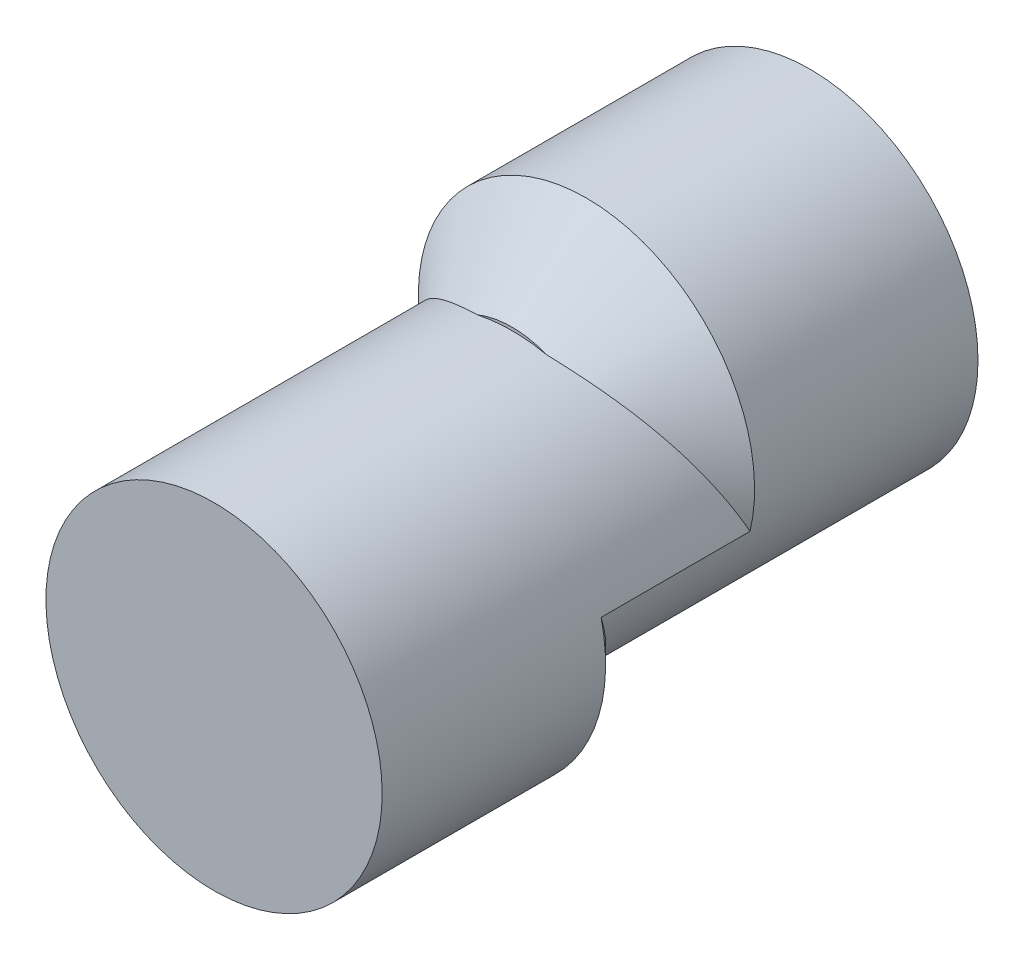
ISO-10303-21;
HEADER;
FILE_DESCRIPTION(('STEP AP214'),'2;1');
FILE_NAME('part.step','',(''),(''),'','','');
FILE_SCHEMA(('AUTOMOTIVE_DESIGN { 1 0 10303 214 1 1 1 1 }'));
ENDSEC;
DATA;
#1=APPLICATION_CONTEXT('core data for automotive mechanical design processes');
#2=APPLICATION_PROTOCOL_DEFINITION('international standard','automotive_design',2000,#1);
#3=PRODUCT_CONTEXT('',#1,'mechanical');
#4=PRODUCT('Part','Part','',(#3));
#5=PRODUCT_RELATED_PRODUCT_CATEGORY('part','',(#4));
#6=PRODUCT_DEFINITION_FORMATION('','',#4);
#7=PRODUCT_DEFINITION_CONTEXT('part definition',#1,'design');
#8=PRODUCT_DEFINITION('design','',#6,#7);
#9=PRODUCT_DEFINITION_SHAPE('','',#8);
#10=(LENGTH_UNIT() NAMED_UNIT(*) SI_UNIT(.MILLI.,.METRE.));
#11=(NAMED_UNIT(*) PLANE_ANGLE_UNIT() SI_UNIT($,.RADIAN.));
#12=(NAMED_UNIT(*) SI_UNIT($,.STERADIAN.) SOLID_ANGLE_UNIT());
#13=UNCERTAINTY_MEASURE_WITH_UNIT(LENGTH_MEASURE(1.E-05),#10,'distance_accuracy_value','');
#14=(GEOMETRIC_REPRESENTATION_CONTEXT(3) GLOBAL_UNCERTAINTY_ASSIGNED_CONTEXT((#13)) GLOBAL_UNIT_ASSIGNED_CONTEXT((#10,
#11,#12)) REPRESENTATION_CONTEXT('',''));
#15=CARTESIAN_POINT('',(0.,0.,0.));
#16=DIRECTION('',(0.,0.,1.));
#17=DIRECTION('',(1.,0.,0.));
#18=AXIS2_PLACEMENT_3D('',#15,#16,#17);
#19=CARTESIAN_POINT('',(0.,0.822072072072072,7.));
#20=DIRECTION('',(0.,0.,-1.));
#21=DIRECTION('',(-1.,0.,0.));
#22=AXIS2_PLACEMENT_3D('',#19,#20,#21);
#23=CYLINDRICAL_SURFACE('',#22,3.95);
#24=CARTESIAN_POINT('',(0.,0.822072072072072,7.));
#25=DIRECTION('',(0.,0.,1.));
#26=DIRECTION('',(1.,0.,0.));
#27=AXIS2_PLACEMENT_3D('',#24,#25,#26);
#28=CIRCLE('',#27,3.95);
#29=CARTESIAN_POINT('',(-0.817850044232283,-3.04233231995903,7.));
#30=VERTEX_POINT('',#29);
#31=CARTESIAN_POINT('',(0.817850044232283,-3.04233231995903,7.));
#32=VERTEX_POINT('',#31);
#33=EDGE_CURVE('E126',#30,#32,#28,.T.);
#34=ORIENTED_EDGE('',*,*,#33,.F.);
#35=CARTESIAN_POINT('',(-0.817850044232284,-3.04233231995903,7.));
#36=CARTESIAN_POINT('',(-0.912082582638536,-3.0223924852395,7.01651049900244));
#37=CARTESIAN_POINT('',(-1.00507197133809,-2.99910784635031,7.03561319296323));
#38=CARTESIAN_POINT('',(-1.18807390143181,-2.94622171986774,7.07831128281761));
#39=CARTESIAN_POINT('',(-1.27808949485708,-2.91662695671472,7.10190189326148));
#40=CARTESIAN_POINT('',(-1.54223198031981,-2.8192316380572,7.17814181924992));
#41=CARTESIAN_POINT('',(-1.71153413884567,-2.74258516675664,7.23646234309769));
#42=CARTESIAN_POINT('',(-2.04227882898572,-2.56445527612452,7.3662926797048));
#43=CARTESIAN_POINT('',(-2.2029818184253,-2.46197669206169,7.43829230832619));
#44=CARTESIAN_POINT('',(-2.50627736822124,-2.23681839039009,7.58947122317375));
#45=CARTESIAN_POINT('',(-2.6488307041962,-2.11409619335581,7.66866544618592));
#46=CARTESIAN_POINT('',(-2.94146233487049,-1.82388392597771,7.84791554108272));
#47=CARTESIAN_POINT('',(-3.08700773469803,-1.65238336517062,7.94890047611089));
#48=CARTESIAN_POINT('',(-3.34648402817079,-1.28824988998564,8.15299210206665));
#49=CARTESIAN_POINT('',(-3.46043500514819,-1.09563050918966,8.25609740017638));
#50=CARTESIAN_POINT('',(-3.6193832482977,-0.766305760925952,8.42470870122634));
#51=CARTESIAN_POINT('',(-3.67443451002463,-0.634442995210983,8.49038438528838));
#52=CARTESIAN_POINT('',(-3.76997644920464,-0.365414659297381,8.62090972014171));
#53=CARTESIAN_POINT('',(-3.81048820823831,-0.22825708876252,8.68576043432434));
#54=CARTESIAN_POINT('',(-3.84350274372788,-0.0889639639639634,8.75));
#55=B_SPLINE_CURVE_WITH_KNOTS('',3,(#35,#36,#37,#38,#39,#40,#41,#42,#43,#44,#45,#46,#47,#48,#49,
#50,#51,#52,#53,#54),.UNSPECIFIED.,.F.,.F.,(4,2,2,2,2,2,2,2,2,4),(0.,0.292942004280142,
0.585573378765179,1.16750707255859,1.7766973323255,2.38718257666698,3.1238281391609,
3.86000436586059,4.33108446072667,4.80147872594641),.UNSPECIFIED.);
#56=CARTESIAN_POINT('',(-3.84350274372788,-0.0889639639639638,8.75));
#57=VERTEX_POINT('',#56);
#58=EDGE_CURVE('E11',#30,#57,#55,.T.);
#59=ORIENTED_EDGE('',*,*,#58,.T.);
#60=DIRECTION('',(0.,0.,-1.));
#61=VECTOR('',#60,1.);
#62=CARTESIAN_POINT('',(-3.84350274372788,-0.0889639639639638,7.));
#63=LINE('',#62,#61);
#64=CARTESIAN_POINT('',(-3.84350274372788,-0.0889639639639638,5.24999999999999));
#65=VERTEX_POINT('',#64);
#66=EDGE_CURVE('E138',#57,#65,#63,.T.);
#67=ORIENTED_EDGE('',*,*,#66,.T.);
#68=CARTESIAN_POINT('',(0.,0.822072072072072,5.24999999999999));
#69=DIRECTION('',(0.,0.,1.));
#70=DIRECTION('',(1.,0.,0.));
#71=AXIS2_PLACEMENT_3D('',#68,#69,#70);
#72=CIRCLE('',#71,3.95);
#73=CARTESIAN_POINT('',(3.84350274372788,-0.0889639639639638,5.24999999999999));
#74=VERTEX_POINT('',#73);
#75=EDGE_CURVE('E135',#65,#74,#72,.F.);
#76=ORIENTED_EDGE('',*,*,#75,.T.);
#77=DIRECTION('',(0.,0.,-1.));
#78=VECTOR('',#77,1.);
#79=CARTESIAN_POINT('',(3.84350274372788,-0.0889639639639638,5.24999999999999));
#80=LINE('',#79,#78);
#81=CARTESIAN_POINT('',(3.84350274372788,-0.0889639639639638,8.75));
#82=VERTEX_POINT('',#81);
#83=EDGE_CURVE('E133',#74,#82,#80,.F.);
#84=ORIENTED_EDGE('',*,*,#83,.T.);
#85=CARTESIAN_POINT('',(3.84350274372788,-0.0889639639639638,8.75));
#86=CARTESIAN_POINT('',(3.81528769779431,-0.20797122697141,8.69510735005948));
#87=CARTESIAN_POINT('',(3.78161742052337,-0.325406206503519,8.63978680771635));
#88=CARTESIAN_POINT('',(3.70367041907941,-0.556408073284509,8.52855999596291));
#89=CARTESIAN_POINT('',(3.65939423951785,-0.669975158807256,8.47265375676896));
#90=CARTESIAN_POINT('',(3.5110404817319,-1.00395867488094,8.30437684903749));
#91=CARTESIAN_POINT('',(3.39147681532019,-1.21749378591338,8.19152326659151));
#92=CARTESIAN_POINT('',(3.11442796893997,-1.61979077842719,7.96803786349388));
#93=CARTESIAN_POINT('',(2.95690765466462,-1.8085294556744,7.85740820479857));
#94=CARTESIAN_POINT('',(2.60700994836441,-2.15560786504676,7.64301673621841));
#95=CARTESIAN_POINT('',(2.41464321116462,-2.31395685888512,7.53925284022612));
#96=CARTESIAN_POINT('',(2.12460170019812,-2.50936020798202,7.40455946929118));
#97=CARTESIAN_POINT('',(2.03988481876867,-2.56192181069743,7.36748258003037));
#98=CARTESIAN_POINT('',(1.86575297698397,-2.66095620959624,7.29620671982021));
#99=CARTESIAN_POINT('',(1.77633771639555,-2.70742861600672,7.26200793314992));
#100=CARTESIAN_POINT('',(1.59343136564689,-2.79368135750707,7.19732480125986));
#101=CARTESIAN_POINT('',(1.49995421738171,-2.83348260882192,7.16682893233663));
#102=CARTESIAN_POINT('',(1.30907370662775,-2.9060960302151,7.11025202259054));
#103=CARTESIAN_POINT('',(1.21167311590006,-2.93891303487362,7.08416793046654));
#104=CARTESIAN_POINT('',(1.06421775276788,-2.98219966458105,7.04928069187929));
#105=CARTESIAN_POINT('',(1.01545242094585,-2.99550890014833,7.03846704301152));
#106=CARTESIAN_POINT('',(0.91718664510798,-3.02030167100528,7.01819407300388));
#107=CARTESIAN_POINT('',(0.867686260218656,-3.03178535227918,7.00873464357707));
#108=CARTESIAN_POINT('',(0.817850044232287,-3.04233231995903,6.99999999999999));
#109=B_SPLINE_CURVE_WITH_KNOTS('',3,(#85,#86,#87,#88,#89,#90,#91,#92,#93,#94,#95,#96,#97,#98,
#99,#100,#101,#102,#103,#104,#105,#106,#107,#108),.UNSPECIFIED.,.F.,.F.,(4,2,2,2,2,2,2,2,2,2,2,
4),(0.,0.401917559158201,0.803814484333555,1.60815418667301,2.41324130000954,3.21808265993525,
3.53695551739659,3.85584877613042,4.17372269974228,4.49137586630428,4.64640565446899,
4.80142303911338),.UNSPECIFIED.);
#110=EDGE_CURVE('E50',#82,#32,#109,.T.);
#111=ORIENTED_EDGE('',*,*,#110,.T.);
#112=EDGE_LOOP('',(#34,#59,#67,#76,#84,#111));
#113=FACE_BOUND('',#112,.T.);
#114=CARTESIAN_POINT('',(0.,0.822072072072072,0.));
#115=DIRECTION('',(0.,0.,1.));
#116=DIRECTION('',(1.,0.,0.));
#117=AXIS2_PLACEMENT_3D('',#114,#115,#116);
#118=CIRCLE('',#117,3.95);
#119=CARTESIAN_POINT('',(3.95,0.822072072072072,0.));
#120=VERTEX_POINT('',#119);
#121=EDGE_CURVE('E123',#120,#120,#118,.T.);
#122=ORIENTED_EDGE('',*,*,#121,.T.);
#123=EDGE_LOOP('',(#122));
#124=FACE_BOUND('',#123,.T.);
#125=ADVANCED_FACE('F35',(#113,#124),#23,.T.);
#126=CARTESIAN_POINT('',(0.,0.822072072072072,7.));
#127=DIRECTION('',(0.,0.,1.));
#128=DIRECTION('',(1.,0.,0.));
#129=AXIS2_PLACEMENT_3D('',#126,#127,#128);
#130=PLANE('',#129);
#131=CARTESIAN_POINT('',(0.,-1.,7.));
#132=DIRECTION('',(0.,0.,1.));
#133=DIRECTION('',(1.,0.,0.));
#134=AXIS2_PLACEMENT_3D('',#131,#132,#133);
#135=CIRCLE('',#134,3.95);
#136=CARTESIAN_POINT('',(0.817850044232321,2.86440439203109,7.));
#137=VERTEX_POINT('',#136);
#138=CARTESIAN_POINT('',(-0.817850044232321,2.86440439203109,7.));
#139=VERTEX_POINT('',#138);
#140=EDGE_CURVE('E118',#137,#139,#135,.T.);
#141=ORIENTED_EDGE('',*,*,#140,.F.);
#142=CARTESIAN_POINT('',(0.,0.822072072072072,7.));
#143=DIRECTION('',(0.,0.,1.));
#144=DIRECTION('',(1.,0.,0.));
#145=AXIS2_PLACEMENT_3D('',#142,#143,#144);
#146=CIRCLE('',#145,2.2);
#147=EDGE_CURVE('E128',#137,#139,#146,.T.);
#148=ORIENTED_EDGE('',*,*,#147,.T.);
#149=EDGE_LOOP('',(#141,#148));
#150=FACE_BOUND('',#149,.T.);
#151=ADVANCED_FACE('F170',(#150),#130,.T.);
#152=CARTESIAN_POINT('',(0.,0.822072072072072,0.));
#153=DIRECTION('',(0.,0.,1.));
#154=DIRECTION('',(1.,0.,0.));
#155=AXIS2_PLACEMENT_3D('',#152,#153,#154);
#156=PLANE('',#155);
#157=DIRECTION('',(-1.,0.,0.));
#158=VECTOR('',#157,1.);
#159=CARTESIAN_POINT('',(-1.56524758424985,2.2,0.));
#160=LINE('',#159,#158);
#161=CARTESIAN_POINT('',(1.56524758424985,2.2,0.));
#162=VERTEX_POINT('',#161);
#163=CARTESIAN_POINT('',(-1.56524758424985,2.2,0.));
#164=VERTEX_POINT('',#163);
#165=EDGE_CURVE('E105',#162,#164,#160,.T.);
#166=ORIENTED_EDGE('',*,*,#165,.T.);
#167=CARTESIAN_POINT('',(0.,0.,0.));
#168=DIRECTION('',(0.,0.,1.));
#169=DIRECTION('',(1.,0.,0.));
#170=AXIS2_PLACEMENT_3D('',#167,#168,#169);
#171=CIRCLE('',#170,2.7);
#172=EDGE_CURVE('E97',#164,#162,#171,.T.);
#173=ORIENTED_EDGE('',*,*,#172,.T.);
#174=EDGE_LOOP('',(#166,#173));
#175=FACE_BOUND('',#174,.T.);
#176=ORIENTED_EDGE('',*,*,#121,.F.);
#177=EDGE_LOOP('',(#176));
#178=FACE_BOUND('',#177,.T.);
#179=ADVANCED_FACE('F111',(#175,#178),#156,.F.);
#180=CARTESIAN_POINT('',(0.,-1.,7.));
#181=DIRECTION('',(0.,0.,1.));
#182=DIRECTION('',(1.,0.,0.));
#183=AXIS2_PLACEMENT_3D('',#180,#181,#182);
#184=PLANE('',#183);
#185=ORIENTED_EDGE('',*,*,#33,.T.);
#186=CARTESIAN_POINT('',(0.,-1.,7.));
#187=DIRECTION('',(0.,0.,1.));
#188=DIRECTION('',(1.,0.,0.));
#189=AXIS2_PLACEMENT_3D('',#186,#187,#188);
#190=CIRCLE('',#189,2.19999999999999);
#191=EDGE_CURVE('E62',#32,#30,#190,.F.);
#192=ORIENTED_EDGE('',*,*,#191,.T.);
#193=EDGE_LOOP('',(#185,#192));
#194=FACE_BOUND('',#193,.T.);
#195=ADVANCED_FACE('F232',(#194),#184,.F.);
#196=CARTESIAN_POINT('',(0.,-1.,14.));
#197=DIRECTION('',(0.,0.,-1.));
#198=DIRECTION('',(-1.,0.,0.));
#199=AXIS2_PLACEMENT_3D('',#196,#197,#198);
#200=CYLINDRICAL_SURFACE('',#199,3.95);
#201=CARTESIAN_POINT('',(0.,-1.,14.));
#202=DIRECTION('',(0.,0.,1.));
#203=DIRECTION('',(1.,0.,0.));
#204=AXIS2_PLACEMENT_3D('',#201,#202,#203);
#205=CIRCLE('',#204,3.95);
#206=CARTESIAN_POINT('',(3.95,-1.,14.));
#207=VERTEX_POINT('',#206);
#208=EDGE_CURVE('E120',#207,#207,#205,.T.);
#209=ORIENTED_EDGE('',*,*,#208,.F.);
#210=EDGE_LOOP('',(#209));
#211=FACE_BOUND('',#210,.T.);
#212=CARTESIAN_POINT('',(0.,-1.,8.75));
#213=DIRECTION('',(0.,0.,1.));
#214=DIRECTION('',(1.,0.,0.));
#215=AXIS2_PLACEMENT_3D('',#212,#213,#214);
#216=CIRCLE('',#215,3.95);
#217=EDGE_CURVE('E177',#57,#82,#216,.T.);
#218=ORIENTED_EDGE('',*,*,#217,.T.);
#219=ORIENTED_EDGE('',*,*,#83,.F.);
#220=CARTESIAN_POINT('',(3.84350274372788,-0.0889639639639638,5.24999999999999));
#221=CARTESIAN_POINT('',(3.81528769779431,0.0300432990434815,5.30489264994051));
#222=CARTESIAN_POINT('',(3.78161742052337,0.147478278575591,5.36021319228365));
#223=CARTESIAN_POINT('',(3.70367041907941,0.378480145356582,5.47144000403709));
#224=CARTESIAN_POINT('',(3.65939423951785,0.492047230879329,5.52734624323104));
#225=CARTESIAN_POINT('',(3.5110404817319,0.826030746953017,5.69562315096251));
#226=CARTESIAN_POINT('',(3.39147681532019,1.03956585798545,5.80847673340849));
#227=CARTESIAN_POINT('',(3.11442796893997,1.44186285049926,6.03196213650612));
#228=CARTESIAN_POINT('',(2.95690765466462,1.63060152774648,6.14259179520143));
#229=CARTESIAN_POINT('',(2.60700994836441,1.97767993711884,6.35698326378159));
#230=CARTESIAN_POINT('',(2.41464321116462,2.13602893095719,6.46074715977389));
#231=CARTESIAN_POINT('',(2.12460170019812,2.33143228005409,6.59544053070883));
#232=CARTESIAN_POINT('',(2.03988481876867,2.3839938827695,6.63251741996964));
#233=CARTESIAN_POINT('',(1.86575297698397,2.48302828166832,6.7037932801798));
#234=CARTESIAN_POINT('',(1.77633771639554,2.5295006880788,6.73799206685009));
#235=CARTESIAN_POINT('',(1.59343136564688,2.61575342957915,6.80267519874015));
#236=CARTESIAN_POINT('',(1.49995421738171,2.65555468089399,6.83317106766337));
#237=CARTESIAN_POINT('',(1.30907370662774,2.72816810228718,6.88974797740946));
#238=CARTESIAN_POINT('',(1.21167311590006,2.7609851069457,6.91583206953347));
#239=CARTESIAN_POINT('',(1.06421775276788,2.80427173665313,6.95071930812072));
#240=CARTESIAN_POINT('',(1.01545242094586,2.8175809722204,6.96153295698848));
#241=CARTESIAN_POINT('',(0.917186645108003,2.84237374307735,6.98180592699612));
#242=CARTESIAN_POINT('',(0.867686260218687,2.85385742435124,6.99126535642293));
#243=CARTESIAN_POINT('',(0.817850044232326,2.86440439203109,7.00000000000001));
#244=B_SPLINE_CURVE_WITH_KNOTS('',3,(#220,#221,#222,#223,#224,#225,#226,#227,#228,#229,#230,
#231,#232,#233,#234,#235,#236,#237,#238,#239,#240,#241,#242,#243),.UNSPECIFIED.,.F.,.F.,(4,2,2,
2,2,2,2,2,2,2,2,4),(0.,0.401917559158203,0.803814484333557,1.60815418667302,2.41324130000954,
3.21808265993526,3.5369555173966,3.85584877613043,4.17372269974229,4.49137586630429,
4.64640565446898,4.80142303911335),.UNSPECIFIED.);
#245=EDGE_CURVE('E148',#74,#137,#244,.T.);
#246=ORIENTED_EDGE('',*,*,#245,.T.);
#247=ORIENTED_EDGE('',*,*,#140,.T.);
#248=CARTESIAN_POINT('',(-0.817850044232323,2.86440439203109,7.));
#249=CARTESIAN_POINT('',(-0.912082582638576,2.84446455731156,6.98348950099756));
#250=CARTESIAN_POINT('',(-1.00507197133813,2.82117991842238,6.96438680703677));
#251=CARTESIAN_POINT('',(-1.18807390143185,2.76829379193979,6.92168871718239));
#252=CARTESIAN_POINT('',(-1.27808949485712,2.73869902878678,6.89809810673851));
#253=CARTESIAN_POINT('',(-1.54223198031985,2.64130371012925,6.82185818075007));
#254=CARTESIAN_POINT('',(-1.71153413884571,2.56465723882869,6.7635376569023));
#255=CARTESIAN_POINT('',(-2.04227882898576,2.38652734819657,6.63370732029519));
#256=CARTESIAN_POINT('',(-2.20298181842534,2.28404876413373,6.56170769167379));
#257=CARTESIAN_POINT('',(-2.50627736822128,2.05889046246213,6.41052877682623));
#258=CARTESIAN_POINT('',(-2.64883070419624,1.93616826542785,6.33133455381406));
#259=CARTESIAN_POINT('',(-2.94146233487053,1.64595599804974,6.15208445891725));
#260=CARTESIAN_POINT('',(-3.08700773469806,1.47445543724265,6.05109952388909));
#261=CARTESIAN_POINT('',(-3.34648402817082,1.11032196205767,5.84700789793333));
#262=CARTESIAN_POINT('',(-3.46043500514822,0.91770258126168,5.74390259982359));
#263=CARTESIAN_POINT('',(-3.61938324829772,0.588377832997979,5.57529129877364));
#264=CARTESIAN_POINT('',(-3.67443451002464,0.456515067283019,5.5096156147116));
#265=CARTESIAN_POINT('',(-3.76997644920464,0.187486731369436,5.37909027985827));
#266=CARTESIAN_POINT('',(-3.81048820823831,0.0503291608345839,5.31423956567565));
#267=CARTESIAN_POINT('',(-3.84350274372788,-0.0889639639639644,5.24999999999999));
#268=B_SPLINE_CURVE_WITH_KNOTS('',3,(#248,#249,#250,#251,#252,#253,#254,#255,#256,#257,#258,
#259,#260,#261,#262,#263,#264,#265,#266,#267),.UNSPECIFIED.,.F.,.F.,(4,2,2,2,2,2,2,2,2,4),(0.,
0.292942004280144,0.585573378765183,1.1675070725586,1.77669733232552,2.387182576667,
3.12382813916092,3.86000436586062,4.33108446072667,4.80147872594637),.UNSPECIFIED.);
#269=EDGE_CURVE('E141',#139,#65,#268,.T.);
#270=ORIENTED_EDGE('',*,*,#269,.T.);
#271=ORIENTED_EDGE('',*,*,#66,.F.);
#272=EDGE_LOOP('',(#218,#219,#246,#247,#270,#271));
#273=FACE_BOUND('',#272,.T.);
#274=ADVANCED_FACE('F154',(#211,#273),#200,.T.);
#275=CARTESIAN_POINT('',(0.,-1.,14.));
#276=DIRECTION('',(0.,0.,1.));
#277=DIRECTION('',(1.,0.,0.));
#278=AXIS2_PLACEMENT_3D('',#275,#276,#277);
#279=PLANE('',#278);
#280=ORIENTED_EDGE('',*,*,#208,.T.);
#281=EDGE_LOOP('',(#280));
#282=FACE_BOUND('',#281,.T.);
#283=ADVANCED_FACE('F218',(#282),#279,.T.);
#284=CARTESIAN_POINT('',(0.,0.,0.));
#285=DIRECTION('',(0.,0.,1.));
#286=DIRECTION('',(1.,0.,0.));
#287=AXIS2_PLACEMENT_3D('',#284,#285,#286);
#288=CYLINDRICAL_SURFACE('',#287,2.7);
#289=CARTESIAN_POINT('',(0.,0.,12.));
#290=DIRECTION('',(0.,0.,1.));
#291=DIRECTION('',(1.,0.,0.));
#292=AXIS2_PLACEMENT_3D('',#289,#290,#291);
#293=CIRCLE('',#292,2.7);
#294=CARTESIAN_POINT('',(-1.56524758424985,2.2,12.));
#295=VERTEX_POINT('',#294);
#296=CARTESIAN_POINT('',(1.56524758424985,2.2,12.));
#297=VERTEX_POINT('',#296);
#298=EDGE_CURVE('E100',#295,#297,#293,.T.);
#299=ORIENTED_EDGE('',*,*,#298,.T.);
#300=DIRECTION('',(0.,0.,1.));
#301=VECTOR('',#300,1.);
#302=CARTESIAN_POINT('',(1.56524758424985,2.2,0.));
#303=LINE('',#302,#301);
#304=EDGE_CURVE('E93',#162,#297,#303,.T.);
#305=ORIENTED_EDGE('',*,*,#304,.F.);
#306=ORIENTED_EDGE('',*,*,#172,.F.);
#307=DIRECTION('',(0.,0.,1.));
#308=VECTOR('',#307,1.);
#309=CARTESIAN_POINT('',(-1.56524758424985,2.2,0.));
#310=LINE('',#309,#308);
#311=EDGE_CURVE('E104',#164,#295,#310,.T.);
#312=ORIENTED_EDGE('',*,*,#311,.T.);
#313=EDGE_LOOP('',(#299,#305,#306,#312));
#314=FACE_BOUND('',#313,.T.);
#315=ADVANCED_FACE('F95',(#314),#288,.F.);
#316=CARTESIAN_POINT('',(-1.56524758424985,2.2,0.));
#317=DIRECTION('',(0.,1.,0.));
#318=DIRECTION('',(0.,0.,1.));
#319=AXIS2_PLACEMENT_3D('',#316,#317,#318);
#320=PLANE('',#319);
#321=DIRECTION('',(-1.,0.,0.));
#322=VECTOR('',#321,1.);
#323=CARTESIAN_POINT('',(-1.56524758424985,2.2,12.));
#324=LINE('',#323,#322);
#325=EDGE_CURVE('E113',#297,#295,#324,.T.);
#326=ORIENTED_EDGE('',*,*,#325,.T.);
#327=ORIENTED_EDGE('',*,*,#311,.F.);
#328=ORIENTED_EDGE('',*,*,#165,.F.);
#329=ORIENTED_EDGE('',*,*,#304,.T.);
#330=EDGE_LOOP('',(#326,#327,#328,#329));
#331=FACE_BOUND('',#330,.T.);
#332=ADVANCED_FACE('F108',(#331),#320,.F.);
#333=CARTESIAN_POINT('',(0.,0.,12.));
#334=DIRECTION('',(0.,0.,1.));
#335=DIRECTION('',(1.,0.,0.));
#336=AXIS2_PLACEMENT_3D('',#333,#334,#335);
#337=PLANE('',#336);
#338=ORIENTED_EDGE('',*,*,#298,.F.);
#339=ORIENTED_EDGE('',*,*,#325,.F.);
#340=EDGE_LOOP('',(#338,#339));
#341=FACE_BOUND('',#340,.T.);
#342=ADVANCED_FACE('F164',(#341),#337,.F.);
#343=CARTESIAN_POINT('',(0.,0.822072072072072,7.));
#344=DIRECTION('',(0.,0.,-1.));
#345=DIRECTION('',(-1.,0.,0.));
#346=AXIS2_PLACEMENT_3D('',#343,#344,#345);
#347=CONICAL_SURFACE('',#346,2.2,0.785398163397446);
#348=ORIENTED_EDGE('',*,*,#245,.F.);
#349=ORIENTED_EDGE('',*,*,#75,.F.);
#350=ORIENTED_EDGE('',*,*,#269,.F.);
#351=ORIENTED_EDGE('',*,*,#147,.F.);
#352=EDGE_LOOP('',(#348,#349,#350,#351));
#353=FACE_BOUND('',#352,.T.);
#354=ADVANCED_FACE('F159',(#353),#347,.T.);
#355=CARTESIAN_POINT('',(0.,-1.,8.75));
#356=DIRECTION('',(0.,0.,1.));
#357=DIRECTION('',(1.,0.,0.));
#358=AXIS2_PLACEMENT_3D('',#355,#356,#357);
#359=CONICAL_SURFACE('',#358,3.95,0.78539816339745);
#360=ORIENTED_EDGE('',*,*,#58,.F.);
#361=ORIENTED_EDGE('',*,*,#191,.F.);
#362=ORIENTED_EDGE('',*,*,#110,.F.);
#363=ORIENTED_EDGE('',*,*,#217,.F.);
#364=EDGE_LOOP('',(#360,#361,#362,#363));
#365=FACE_BOUND('',#364,.T.);
#366=ADVANCED_FACE('F38',(#365),#359,.T.);
#367=CLOSED_SHELL('',(#125,#151,#179,#195,#274,#283,#315,#332,#342,#354,#366));
#368=MANIFOLD_SOLID_BREP('B2',#367);
#369=ADVANCED_BREP_SHAPE_REPRESENTATION('',(#18,#368),#14);
#370=SHAPE_DEFINITION_REPRESENTATION(#9,#369);
ENDSEC;
END-ISO-10303-21;
